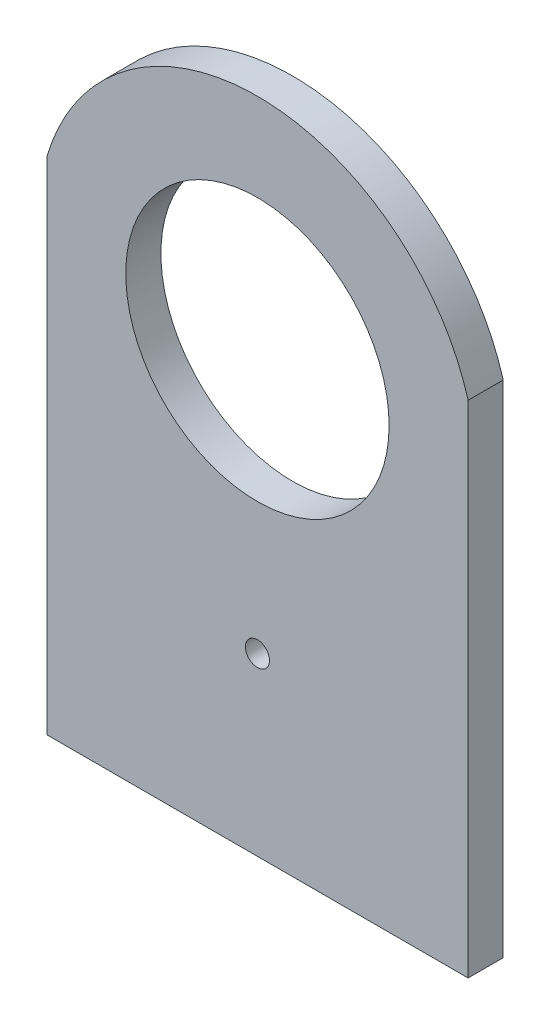
ISO-10303-21;
HEADER;
FILE_DESCRIPTION(('STEP AP214'),'2;1');
FILE_NAME('part.step','',(''),(''),'','','');
FILE_SCHEMA(('AUTOMOTIVE_DESIGN { 1 0 10303 214 1 1 1 1 }'));
ENDSEC;
DATA;
#1=APPLICATION_CONTEXT('core data for automotive mechanical design processes');
#2=APPLICATION_PROTOCOL_DEFINITION('international standard','automotive_design',2000,#1);
#3=PRODUCT_CONTEXT('',#1,'mechanical');
#4=PRODUCT('Part','Part','',(#3));
#5=PRODUCT_RELATED_PRODUCT_CATEGORY('part','',(#4));
#6=PRODUCT_DEFINITION_FORMATION('','',#4);
#7=PRODUCT_DEFINITION_CONTEXT('part definition',#1,'design');
#8=PRODUCT_DEFINITION('design','',#6,#7);
#9=PRODUCT_DEFINITION_SHAPE('','',#8);
#10=(LENGTH_UNIT() NAMED_UNIT(*) SI_UNIT(.MILLI.,.METRE.));
#11=(NAMED_UNIT(*) PLANE_ANGLE_UNIT() SI_UNIT($,.RADIAN.));
#12=(NAMED_UNIT(*) SI_UNIT($,.STERADIAN.) SOLID_ANGLE_UNIT());
#13=UNCERTAINTY_MEASURE_WITH_UNIT(LENGTH_MEASURE(1.E-05),#10,'distance_accuracy_value','');
#14=(GEOMETRIC_REPRESENTATION_CONTEXT(3) GLOBAL_UNCERTAINTY_ASSIGNED_CONTEXT((#13)) GLOBAL_UNIT_ASSIGNED_CONTEXT((#10,
#11,#12)) REPRESENTATION_CONTEXT('',''));
#15=CARTESIAN_POINT('',(0.,0.,0.));
#16=DIRECTION('',(0.,0.,1.));
#17=DIRECTION('',(1.,0.,0.));
#18=AXIS2_PLACEMENT_3D('',#15,#16,#17);
#19=CARTESIAN_POINT('',(0.,100.,8.));
#20=DIRECTION('',(0.,0.,1.));
#21=DIRECTION('',(1.,0.,0.));
#22=AXIS2_PLACEMENT_3D('',#19,#20,#21);
#23=PLANE('',#22);
#24=CARTESIAN_POINT('',(0.,40.,8.));
#25=DIRECTION('',(0.,0.,1.));
#26=DIRECTION('',(1.,0.,0.));
#27=AXIS2_PLACEMENT_3D('',#24,#25,#26);
#28=CIRCLE('',#27,2.75);
#29=CARTESIAN_POINT('',(2.75,40.,8.));
#30=VERTEX_POINT('',#29);
#31=EDGE_CURVE('E133',#30,#30,#28,.T.);
#32=ORIENTED_EDGE('',*,*,#31,.F.);
#33=EDGE_LOOP('',(#32));
#34=FACE_BOUND('',#33,.T.);
#35=DIRECTION('',(0.,1.,0.));
#36=VECTOR('',#35,1.);
#37=CARTESIAN_POINT('',(48.,114.,8.));
#38=LINE('',#37,#36);
#39=CARTESIAN_POINT('',(48.,0.,8.));
#40=VERTEX_POINT('',#39);
#41=CARTESIAN_POINT('',(48.,114.,8.));
#42=VERTEX_POINT('',#41);
#43=EDGE_CURVE('E88',#40,#42,#38,.T.);
#44=ORIENTED_EDGE('',*,*,#43,.T.);
#45=CARTESIAN_POINT('',(0.,100.,8.));
#46=DIRECTION('',(0.,0.,1.));
#47=DIRECTION('',(1.,0.,0.));
#48=AXIS2_PLACEMENT_3D('',#45,#46,#47);
#49=CIRCLE('',#48,50.);
#50=CARTESIAN_POINT('',(-48.,114.,8.));
#51=VERTEX_POINT('',#50);
#52=EDGE_CURVE('E83',#42,#51,#49,.T.);
#53=ORIENTED_EDGE('',*,*,#52,.T.);
#54=DIRECTION('',(0.,-1.,0.));
#55=VECTOR('',#54,1.);
#56=CARTESIAN_POINT('',(-48.,114.,8.));
#57=LINE('',#56,#55);
#58=CARTESIAN_POINT('',(-48.,0.,8.));
#59=VERTEX_POINT('',#58);
#60=EDGE_CURVE('E86',#51,#59,#57,.T.);
#61=ORIENTED_EDGE('',*,*,#60,.T.);
#62=DIRECTION('',(1.,0.,0.));
#63=VECTOR('',#62,1.);
#64=CARTESIAN_POINT('',(-48.,0.,8.));
#65=LINE('',#64,#63);
#66=EDGE_CURVE('E53',#59,#40,#65,.T.);
#67=ORIENTED_EDGE('',*,*,#66,.T.);
#68=EDGE_LOOP('',(#44,#53,#61,#67));
#69=FACE_BOUND('',#68,.T.);
#70=CARTESIAN_POINT('',(0.,100.,8.));
#71=DIRECTION('',(0.,0.,1.));
#72=DIRECTION('',(1.,0.,0.));
#73=AXIS2_PLACEMENT_3D('',#70,#71,#72);
#74=CIRCLE('',#73,30.);
#75=CARTESIAN_POINT('',(30.,100.,8.));
#76=VERTEX_POINT('',#75);
#77=EDGE_CURVE('E104',#76,#76,#74,.T.);
#78=ORIENTED_EDGE('',*,*,#77,.F.);
#79=EDGE_LOOP('',(#78));
#80=FACE_BOUND('',#79,.T.);
#81=ADVANCED_FACE('F35',(#34,#69,#80),#23,.T.);
#82=CARTESIAN_POINT('',(0.,100.,0.));
#83=DIRECTION('',(0.,0.,1.));
#84=DIRECTION('',(1.,0.,0.));
#85=AXIS2_PLACEMENT_3D('',#82,#83,#84);
#86=PLANE('',#85);
#87=CARTESIAN_POINT('',(0.,40.,0.));
#88=DIRECTION('',(0.,0.,1.));
#89=DIRECTION('',(1.,0.,0.));
#90=AXIS2_PLACEMENT_3D('',#87,#88,#89);
#91=CIRCLE('',#90,2.75);
#92=CARTESIAN_POINT('',(2.75,40.,0.));
#93=VERTEX_POINT('',#92);
#94=EDGE_CURVE('E39',#93,#93,#91,.T.);
#95=ORIENTED_EDGE('',*,*,#94,.T.);
#96=EDGE_LOOP('',(#95));
#97=FACE_BOUND('',#96,.T.);
#98=DIRECTION('',(0.,1.,0.));
#99=VECTOR('',#98,1.);
#100=CARTESIAN_POINT('',(48.,114.,0.));
#101=LINE('',#100,#99);
#102=CARTESIAN_POINT('',(48.,0.,0.));
#103=VERTEX_POINT('',#102);
#104=CARTESIAN_POINT('',(48.,114.,0.));
#105=VERTEX_POINT('',#104);
#106=EDGE_CURVE('E101',#103,#105,#101,.T.);
#107=ORIENTED_EDGE('',*,*,#106,.F.);
#108=DIRECTION('',(1.,0.,0.));
#109=VECTOR('',#108,1.);
#110=CARTESIAN_POINT('',(-48.,0.,0.));
#111=LINE('',#110,#109);
#112=CARTESIAN_POINT('',(-48.,0.,0.));
#113=VERTEX_POINT('',#112);
#114=EDGE_CURVE('E76',#113,#103,#111,.T.);
#115=ORIENTED_EDGE('',*,*,#114,.F.);
#116=DIRECTION('',(0.,-1.,0.));
#117=VECTOR('',#116,1.);
#118=CARTESIAN_POINT('',(-48.,114.,0.));
#119=LINE('',#118,#117);
#120=CARTESIAN_POINT('',(-48.,114.,0.));
#121=VERTEX_POINT('',#120);
#122=EDGE_CURVE('E70',#121,#113,#119,.T.);
#123=ORIENTED_EDGE('',*,*,#122,.F.);
#124=CARTESIAN_POINT('',(0.,100.,0.));
#125=DIRECTION('',(0.,0.,1.));
#126=DIRECTION('',(1.,0.,0.));
#127=AXIS2_PLACEMENT_3D('',#124,#125,#126);
#128=CIRCLE('',#127,50.);
#129=EDGE_CURVE('E92',#105,#121,#128,.T.);
#130=ORIENTED_EDGE('',*,*,#129,.F.);
#131=EDGE_LOOP('',(#107,#115,#123,#130));
#132=FACE_BOUND('',#131,.T.);
#133=CARTESIAN_POINT('',(0.,100.,0.));
#134=DIRECTION('',(0.,0.,1.));
#135=DIRECTION('',(1.,0.,0.));
#136=AXIS2_PLACEMENT_3D('',#133,#134,#135);
#137=CIRCLE('',#136,30.);
#138=CARTESIAN_POINT('',(30.,100.,0.));
#139=VERTEX_POINT('',#138);
#140=EDGE_CURVE('E116',#139,#139,#137,.T.);
#141=ORIENTED_EDGE('',*,*,#140,.T.);
#142=EDGE_LOOP('',(#141));
#143=FACE_BOUND('',#142,.T.);
#144=ADVANCED_FACE('F112',(#97,#132,#143),#86,.F.);
#145=CARTESIAN_POINT('',(48.,114.,8.));
#146=DIRECTION('',(-1.,0.,0.));
#147=DIRECTION('',(0.,-1.,0.));
#148=AXIS2_PLACEMENT_3D('',#145,#146,#147);
#149=PLANE('',#148);
#150=ORIENTED_EDGE('',*,*,#106,.T.);
#151=DIRECTION('',(0.,0.,-1.));
#152=VECTOR('',#151,1.);
#153=CARTESIAN_POINT('',(48.,114.,8.));
#154=LINE('',#153,#152);
#155=EDGE_CURVE('E11',#42,#105,#154,.T.);
#156=ORIENTED_EDGE('',*,*,#155,.F.);
#157=ORIENTED_EDGE('',*,*,#43,.F.);
#158=DIRECTION('',(0.,0.,-1.));
#159=VECTOR('',#158,1.);
#160=CARTESIAN_POINT('',(48.,0.,8.));
#161=LINE('',#160,#159);
#162=EDGE_CURVE('E97',#40,#103,#161,.T.);
#163=ORIENTED_EDGE('',*,*,#162,.T.);
#164=EDGE_LOOP('',(#150,#156,#157,#163));
#165=FACE_BOUND('',#164,.T.);
#166=ADVANCED_FACE('F37',(#165),#149,.F.);
#167=CARTESIAN_POINT('',(0.,100.,8.));
#168=DIRECTION('',(0.,0.,-1.));
#169=DIRECTION('',(-1.,0.,0.));
#170=AXIS2_PLACEMENT_3D('',#167,#168,#169);
#171=CYLINDRICAL_SURFACE('',#170,50.);
#172=ORIENTED_EDGE('',*,*,#129,.T.);
#173=DIRECTION('',(0.,0.,-1.));
#174=VECTOR('',#173,1.);
#175=CARTESIAN_POINT('',(-48.,114.,8.));
#176=LINE('',#175,#174);
#177=EDGE_CURVE('E45',#51,#121,#176,.T.);
#178=ORIENTED_EDGE('',*,*,#177,.F.);
#179=ORIENTED_EDGE('',*,*,#52,.F.);
#180=ORIENTED_EDGE('',*,*,#155,.T.);
#181=EDGE_LOOP('',(#172,#178,#179,#180));
#182=FACE_BOUND('',#181,.T.);
#183=ADVANCED_FACE('F91',(#182),#171,.T.);
#184=CARTESIAN_POINT('',(-48.,114.,8.));
#185=DIRECTION('',(1.,0.,0.));
#186=DIRECTION('',(0.,1.,0.));
#187=AXIS2_PLACEMENT_3D('',#184,#185,#186);
#188=PLANE('',#187);
#189=ORIENTED_EDGE('',*,*,#122,.T.);
#190=DIRECTION('',(0.,0.,-1.));
#191=VECTOR('',#190,1.);
#192=CARTESIAN_POINT('',(-48.,0.,8.));
#193=LINE('',#192,#191);
#194=EDGE_CURVE('E93',#59,#113,#193,.T.);
#195=ORIENTED_EDGE('',*,*,#194,.F.);
#196=ORIENTED_EDGE('',*,*,#60,.F.);
#197=ORIENTED_EDGE('',*,*,#177,.T.);
#198=EDGE_LOOP('',(#189,#195,#196,#197));
#199=FACE_BOUND('',#198,.T.);
#200=ADVANCED_FACE('F95',(#199),#188,.F.);
#201=CARTESIAN_POINT('',(-48.,0.,8.));
#202=DIRECTION('',(0.,1.,0.));
#203=DIRECTION('',(0.,0.,1.));
#204=AXIS2_PLACEMENT_3D('',#201,#202,#203);
#205=PLANE('',#204);
#206=CARTESIAN_POINT('',(35.,0.,4.00000000000001));
#207=DIRECTION('',(0.,-1.,0.));
#208=DIRECTION('',(0.,0.,-1.));
#209=AXIS2_PLACEMENT_3D('',#206,#207,#208);
#210=CIRCLE('',#209,2.75);
#211=CARTESIAN_POINT('',(35.,0.,1.25000000000001));
#212=VERTEX_POINT('',#211);
#213=EDGE_CURVE('E128',#212,#212,#210,.T.);
#214=ORIENTED_EDGE('',*,*,#213,.F.);
#215=EDGE_LOOP('',(#214));
#216=FACE_BOUND('',#215,.T.);
#217=CARTESIAN_POINT('',(-35.,0.,4.));
#218=DIRECTION('',(0.,-1.,0.));
#219=DIRECTION('',(0.,0.,-1.));
#220=AXIS2_PLACEMENT_3D('',#217,#218,#219);
#221=CIRCLE('',#220,2.75);
#222=CARTESIAN_POINT('',(-35.,0.,1.25));
#223=VERTEX_POINT('',#222);
#224=EDGE_CURVE('E122',#223,#223,#221,.T.);
#225=ORIENTED_EDGE('',*,*,#224,.F.);
#226=EDGE_LOOP('',(#225));
#227=FACE_BOUND('',#226,.T.);
#228=ORIENTED_EDGE('',*,*,#114,.T.);
#229=ORIENTED_EDGE('',*,*,#162,.F.);
#230=ORIENTED_EDGE('',*,*,#66,.F.);
#231=ORIENTED_EDGE('',*,*,#194,.T.);
#232=EDGE_LOOP('',(#228,#229,#230,#231));
#233=FACE_BOUND('',#232,.T.);
#234=ADVANCED_FACE('F109',(#216,#227,#233),#205,.F.);
#235=CARTESIAN_POINT('',(0.,100.,8.));
#236=DIRECTION('',(0.,0.,-1.));
#237=DIRECTION('',(-1.,0.,0.));
#238=AXIS2_PLACEMENT_3D('',#235,#236,#237);
#239=CYLINDRICAL_SURFACE('',#238,30.);
#240=ORIENTED_EDGE('',*,*,#77,.T.);
#241=EDGE_LOOP('',(#240));
#242=FACE_BOUND('',#241,.T.);
#243=ORIENTED_EDGE('',*,*,#140,.F.);
#244=EDGE_LOOP('',(#243));
#245=FACE_BOUND('',#244,.T.);
#246=ADVANCED_FACE('F160',(#242,#245),#239,.F.);
#247=CARTESIAN_POINT('',(-35.,50.,4.));
#248=DIRECTION('',(0.,-1.,0.));
#249=DIRECTION('',(0.,0.,-1.));
#250=AXIS2_PLACEMENT_3D('',#247,#248,#249);
#251=CYLINDRICAL_SURFACE('',#250,2.75);
#252=CARTESIAN_POINT('',(-35.,50.,4.));
#253=DIRECTION('',(0.,-1.,0.));
#254=DIRECTION('',(0.,0.,-1.));
#255=AXIS2_PLACEMENT_3D('',#252,#253,#254);
#256=CIRCLE('',#255,2.75);
#257=CARTESIAN_POINT('',(-35.,50.,1.25));
#258=VERTEX_POINT('',#257);
#259=EDGE_CURVE('E125',#258,#258,#256,.T.);
#260=ORIENTED_EDGE('',*,*,#259,.F.);
#261=EDGE_LOOP('',(#260));
#262=FACE_BOUND('',#261,.T.);
#263=ORIENTED_EDGE('',*,*,#224,.T.);
#264=EDGE_LOOP('',(#263));
#265=FACE_BOUND('',#264,.T.);
#266=ADVANCED_FACE('F208',(#262,#265),#251,.F.);
#267=CARTESIAN_POINT('',(-35.,50.,4.));
#268=DIRECTION('',(0.,-1.,0.));
#269=DIRECTION('',(0.,0.,-1.));
#270=AXIS2_PLACEMENT_3D('',#267,#268,#269);
#271=PLANE('',#270);
#272=ORIENTED_EDGE('',*,*,#259,.T.);
#273=EDGE_LOOP('',(#272));
#274=FACE_BOUND('',#273,.T.);
#275=ADVANCED_FACE('F199',(#274),#271,.T.);
#276=CARTESIAN_POINT('',(35.,50.,4.00000000000001));
#277=DIRECTION('',(0.,-1.,0.));
#278=DIRECTION('',(0.,0.,-1.));
#279=AXIS2_PLACEMENT_3D('',#276,#277,#278);
#280=CYLINDRICAL_SURFACE('',#279,2.75);
#281=CARTESIAN_POINT('',(35.,50.,4.00000000000001));
#282=DIRECTION('',(0.,-1.,0.));
#283=DIRECTION('',(0.,0.,-1.));
#284=AXIS2_PLACEMENT_3D('',#281,#282,#283);
#285=CIRCLE('',#284,2.75);
#286=CARTESIAN_POINT('',(35.,50.,1.25000000000001));
#287=VERTEX_POINT('',#286);
#288=EDGE_CURVE('E119',#287,#287,#285,.T.);
#289=ORIENTED_EDGE('',*,*,#288,.F.);
#290=EDGE_LOOP('',(#289));
#291=FACE_BOUND('',#290,.T.);
#292=ORIENTED_EDGE('',*,*,#213,.T.);
#293=EDGE_LOOP('',(#292));
#294=FACE_BOUND('',#293,.T.);
#295=ADVANCED_FACE('F148',(#291,#294),#280,.F.);
#296=CARTESIAN_POINT('',(35.,50.,4.00000000000001));
#297=DIRECTION('',(0.,-1.,0.));
#298=DIRECTION('',(0.,0.,-1.));
#299=AXIS2_PLACEMENT_3D('',#296,#297,#298);
#300=PLANE('',#299);
#301=ORIENTED_EDGE('',*,*,#288,.T.);
#302=EDGE_LOOP('',(#301));
#303=FACE_BOUND('',#302,.T.);
#304=ADVANCED_FACE('F143',(#303),#300,.T.);
#305=CARTESIAN_POINT('',(0.,40.,-12.));
#306=DIRECTION('',(0.,0.,1.));
#307=DIRECTION('',(1.,0.,0.));
#308=AXIS2_PLACEMENT_3D('',#305,#306,#307);
#309=CYLINDRICAL_SURFACE('',#308,2.75);
#310=ORIENTED_EDGE('',*,*,#31,.T.);
#311=EDGE_LOOP('',(#310));
#312=FACE_BOUND('',#311,.T.);
#313=ORIENTED_EDGE('',*,*,#94,.F.);
#314=EDGE_LOOP('',(#313));
#315=FACE_BOUND('',#314,.T.);
#316=ADVANCED_FACE('F141',(#312,#315),#309,.F.);
#317=CLOSED_SHELL('',(#81,#144,#166,#183,#200,#234,#246,#266,#275,#295,#304,#316));
#318=MANIFOLD_SOLID_BREP('B2',#317);
#319=ADVANCED_BREP_SHAPE_REPRESENTATION('',(#18,#318),#14);
#320=SHAPE_DEFINITION_REPRESENTATION(#9,#319);
ENDSEC;
END-ISO-10303-21;
